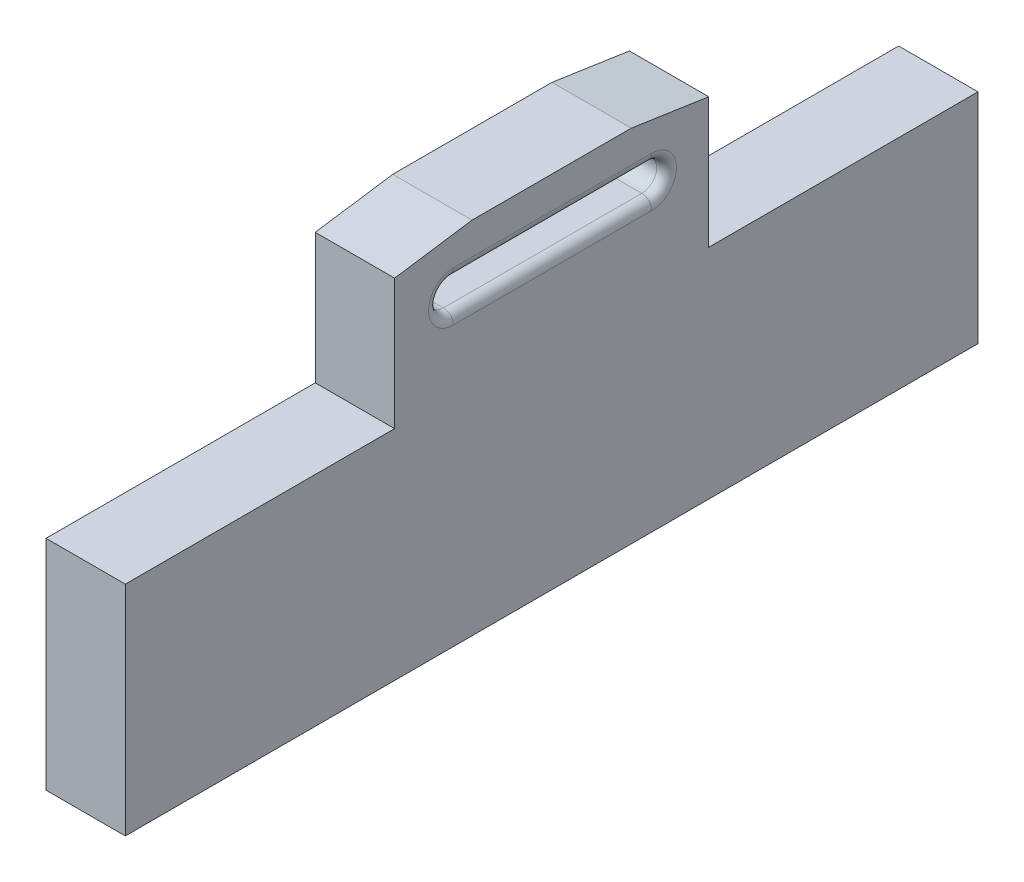
ISO-10303-21;
HEADER;
FILE_DESCRIPTION(('STEP AP214'),'2;1');
FILE_NAME('part.step','',(''),(''),'','','');
FILE_SCHEMA(('AUTOMOTIVE_DESIGN { 1 0 10303 214 1 1 1 1 }'));
ENDSEC;
DATA;
#1=APPLICATION_CONTEXT('core data for automotive mechanical design processes');
#2=APPLICATION_PROTOCOL_DEFINITION('international standard','automotive_design',2000,#1);
#3=PRODUCT_CONTEXT('',#1,'mechanical');
#4=PRODUCT('Part','Part','',(#3));
#5=PRODUCT_RELATED_PRODUCT_CATEGORY('part','',(#4));
#6=PRODUCT_DEFINITION_FORMATION('','',#4);
#7=PRODUCT_DEFINITION_CONTEXT('part definition',#1,'design');
#8=PRODUCT_DEFINITION('design','',#6,#7);
#9=PRODUCT_DEFINITION_SHAPE('','',#8);
#10=(LENGTH_UNIT() NAMED_UNIT(*) SI_UNIT(.MILLI.,.METRE.));
#11=(NAMED_UNIT(*) PLANE_ANGLE_UNIT() SI_UNIT($,.RADIAN.));
#12=(NAMED_UNIT(*) SI_UNIT($,.STERADIAN.) SOLID_ANGLE_UNIT());
#13=UNCERTAINTY_MEASURE_WITH_UNIT(LENGTH_MEASURE(1.E-05),#10,'distance_accuracy_value','');
#14=(GEOMETRIC_REPRESENTATION_CONTEXT(3) GLOBAL_UNCERTAINTY_ASSIGNED_CONTEXT((#13)) GLOBAL_UNIT_ASSIGNED_CONTEXT((#10,
#11,#12)) REPRESENTATION_CONTEXT('',''));
#15=CARTESIAN_POINT('',(0.,0.,0.));
#16=DIRECTION('',(0.,0.,1.));
#17=DIRECTION('',(1.,0.,0.));
#18=AXIS2_PLACEMENT_3D('',#15,#16,#17);
#19=CARTESIAN_POINT('',(8.,14.3083553702862,0.));
#20=DIRECTION('',(0.,0.,-1.));
#21=DIRECTION('',(0.,1.,0.));
#22=AXIS2_PLACEMENT_3D('',#19,#20,#21);
#23=PLANE('',#22);
#24=DIRECTION('',(0.,-1.,0.));
#25=VECTOR('',#24,1.);
#26=CARTESIAN_POINT('',(8.,14.3083553702862,0.));
#27=LINE('',#26,#25);
#28=CARTESIAN_POINT('',(8.,0.,-3.67644744589331E-07));
#29=VERTEX_POINT('',#28);
#30=CARTESIAN_POINT('',(8.,-21.9999843225533,-2.20076296026999E-07));
#31=VERTEX_POINT('',#30);
#32=EDGE_CURVE('E238',#29,#31,#27,.T.);
#33=ORIENTED_EDGE('',*,*,#32,.F.);
#34=DIRECTION('',(-1.,0.,0.));
#35=VECTOR('',#34,1.);
#36=CARTESIAN_POINT('',(8.,0.,-3.67644744589331E-07));
#37=LINE('',#36,#35);
#38=CARTESIAN_POINT('',(0.,0.,-3.67644744589331E-07));
#39=VERTEX_POINT('',#38);
#40=EDGE_CURVE('E217',#29,#39,#37,.T.);
#41=ORIENTED_EDGE('',*,*,#40,.T.);
#42=DIRECTION('',(0.,-1.,0.));
#43=VECTOR('',#42,1.);
#44=CARTESIAN_POINT('',(0.,14.3083553702862,0.));
#45=LINE('',#44,#43);
#46=CARTESIAN_POINT('',(0.,-21.9999843225533,0.));
#47=VERTEX_POINT('',#46);
#48=EDGE_CURVE('E235',#39,#47,#45,.T.);
#49=ORIENTED_EDGE('',*,*,#48,.T.);
#50=DIRECTION('',(-1.,0.,0.));
#51=VECTOR('',#50,1.);
#52=CARTESIAN_POINT('',(8.,-21.9999843225533,-2.20076296026999E-07));
#53=LINE('',#52,#51);
#54=EDGE_CURVE('E230',#31,#47,#53,.T.);
#55=ORIENTED_EDGE('',*,*,#54,.F.);
#56=EDGE_LOOP('',(#33,#41,#49,#55));
#57=FACE_BOUND('',#56,.T.);
#58=ADVANCED_FACE('F31',(#57),#23,.F.);
#59=CARTESIAN_POINT('',(8.,14.3083553702862,-86.0000000000091));
#60=DIRECTION('',(0.,0.,1.));
#61=DIRECTION('',(1.,0.,0.));
#62=AXIS2_PLACEMENT_3D('',#59,#60,#61);
#63=PLANE('',#62);
#64=DIRECTION('',(0.,1.,0.));
#65=VECTOR('',#64,1.);
#66=CARTESIAN_POINT('',(0.,14.3083553702862,-86.0000000000091));
#67=LINE('',#66,#65);
#68=CARTESIAN_POINT('',(0.,-21.9999843225533,-86.0000000000091));
#69=VERTEX_POINT('',#68);
#70=CARTESIAN_POINT('',(0.,0.,-85.9999996323643));
#71=VERTEX_POINT('',#70);
#72=EDGE_CURVE('E246',#69,#71,#67,.T.);
#73=ORIENTED_EDGE('',*,*,#72,.T.);
#74=DIRECTION('',(-1.,0.,0.));
#75=VECTOR('',#74,1.);
#76=CARTESIAN_POINT('',(8.,0.,-85.9999996323643));
#77=LINE('',#76,#75);
#78=CARTESIAN_POINT('',(8.,0.,-85.9999996323643));
#79=VERTEX_POINT('',#78);
#80=EDGE_CURVE('E196',#79,#71,#77,.T.);
#81=ORIENTED_EDGE('',*,*,#80,.F.);
#82=DIRECTION('',(0.,1.,0.));
#83=VECTOR('',#82,1.);
#84=CARTESIAN_POINT('',(8.,14.3083553702862,-86.0000000000091));
#85=LINE('',#84,#83);
#86=CARTESIAN_POINT('',(8.,-21.9999843225533,-86.0000000000091));
#87=VERTEX_POINT('',#86);
#88=EDGE_CURVE('E183',#87,#79,#85,.T.);
#89=ORIENTED_EDGE('',*,*,#88,.F.);
#90=DIRECTION('',(-1.,0.,0.));
#91=VECTOR('',#90,1.);
#92=CARTESIAN_POINT('',(8.,-21.9999843225533,-86.0000000000091));
#93=LINE('',#92,#91);
#94=EDGE_CURVE('E232',#87,#69,#93,.T.);
#95=ORIENTED_EDGE('',*,*,#94,.T.);
#96=EDGE_LOOP('',(#73,#81,#89,#95));
#97=FACE_BOUND('',#96,.T.);
#98=ADVANCED_FACE('F363',(#97),#63,.F.);
#99=CARTESIAN_POINT('',(8.,14.3083553702862,0.));
#100=DIRECTION('',(0.,-1.,0.));
#101=DIRECTION('',(0.,0.,-1.));
#102=AXIS2_PLACEMENT_3D('',#99,#100,#101);
#103=PLANE('',#102);
#104=DIRECTION('',(0.,0.,1.));
#105=VECTOR('',#104,1.);
#106=CARTESIAN_POINT('',(8.,14.3083553702862,0.));
#107=LINE('',#106,#105);
#108=CARTESIAN_POINT('',(8.,14.3083553702862,-51.0327021759425));
#109=VERTEX_POINT('',#108);
#110=CARTESIAN_POINT('',(8.,14.3083553702862,-34.9672978240665));
#111=VERTEX_POINT('',#110);
#112=EDGE_CURVE('E242',#109,#111,#107,.T.);
#113=ORIENTED_EDGE('',*,*,#112,.F.);
#114=DIRECTION('',(-1.,0.,0.));
#115=VECTOR('',#114,1.);
#116=CARTESIAN_POINT('',(8.,14.3083553702862,-51.0327021759425));
#117=LINE('',#116,#115);
#118=CARTESIAN_POINT('',(0.,14.3083553702862,-51.0327021759425));
#119=VERTEX_POINT('',#118);
#120=EDGE_CURVE('E198',#109,#119,#117,.T.);
#121=ORIENTED_EDGE('',*,*,#120,.T.);
#122=DIRECTION('',(0.,0.,1.));
#123=VECTOR('',#122,1.);
#124=CARTESIAN_POINT('',(0.,14.3083553702862,0.));
#125=LINE('',#124,#123);
#126=CARTESIAN_POINT('',(0.,14.3083553702862,-34.9672978240666));
#127=VERTEX_POINT('',#126);
#128=EDGE_CURVE('E240',#119,#127,#125,.T.);
#129=ORIENTED_EDGE('',*,*,#128,.T.);
#130=DIRECTION('',(1.,0.,0.));
#131=VECTOR('',#130,1.);
#132=CARTESIAN_POINT('',(8.,14.3083553702862,-34.9672978240665));
#133=LINE('',#132,#131);
#134=EDGE_CURVE('E220',#127,#111,#133,.T.);
#135=ORIENTED_EDGE('',*,*,#134,.T.);
#136=EDGE_LOOP('',(#113,#121,#129,#135));
#137=FACE_BOUND('',#136,.T.);
#138=ADVANCED_FACE('F368',(#137),#103,.F.);
#139=CARTESIAN_POINT('',(8.,-30.6125026920477,0.));
#140=DIRECTION('',(1.,0.,0.));
#141=DIRECTION('',(0.,0.,-1.));
#142=AXIS2_PLACEMENT_3D('',#139,#140,#141);
#143=PLANE('',#142);
#144=DIRECTION('',(0.,0.,1.));
#145=VECTOR('',#144,1.);
#146=CARTESIAN_POINT('',(8.,6.0850035920881,-33.0899455057634));
#147=LINE('',#146,#145);
#148=CARTESIAN_POINT('',(8.,6.08500359208809,-53.0899455057634));
#149=VERTEX_POINT('',#148);
#150=CARTESIAN_POINT('',(8.,6.0850035920881,-33.0899455057634));
#151=VERTEX_POINT('',#150);
#152=EDGE_CURVE('E256',#149,#151,#147,.T.);
#153=ORIENTED_EDGE('',*,*,#152,.T.);
#154=CARTESIAN_POINT('',(8.,8.5850035920881,-33.0899455057634));
#155=DIRECTION('',(1.,0.,0.));
#156=DIRECTION('',(0.,0.,-1.));
#157=AXIS2_PLACEMENT_3D('',#154,#155,#156);
#158=CIRCLE('',#157,2.5);
#159=CARTESIAN_POINT('',(8.,11.0850035920881,-33.0899455057634));
#160=VERTEX_POINT('',#159);
#161=EDGE_CURVE('E258',#151,#160,#158,.F.);
#162=ORIENTED_EDGE('',*,*,#161,.T.);
#163=DIRECTION('',(0.,0.,-1.));
#164=VECTOR('',#163,1.);
#165=CARTESIAN_POINT('',(8.,11.0850035920881,-53.0899455057634));
#166=LINE('',#165,#164);
#167=CARTESIAN_POINT('',(8.,11.0850035920881,-53.0899455057634));
#168=VERTEX_POINT('',#167);
#169=EDGE_CURVE('E252',#160,#168,#166,.T.);
#170=ORIENTED_EDGE('',*,*,#169,.T.);
#171=CARTESIAN_POINT('',(8.,8.5850035920881,-53.0899455057634));
#172=DIRECTION('',(1.,0.,0.));
#173=DIRECTION('',(0.,0.,-1.));
#174=AXIS2_PLACEMENT_3D('',#171,#172,#173);
#175=CIRCLE('',#174,2.5);
#176=EDGE_CURVE('E254',#168,#149,#175,.F.);
#177=ORIENTED_EDGE('',*,*,#176,.T.);
#178=EDGE_LOOP('',(#153,#162,#170,#177));
#179=FACE_BOUND('',#178,.T.);
#180=DIRECTION('',(0.,0.,1.));
#181=VECTOR('',#180,1.);
#182=CARTESIAN_POINT('',(8.,0.,-85.9999996323643));
#183=LINE('',#182,#181);
#184=CARTESIAN_POINT('',(8.,0.,-58.8427380262315));
#185=VERTEX_POINT('',#184);
#186=EDGE_CURVE('E162',#79,#185,#183,.T.);
#187=ORIENTED_EDGE('',*,*,#186,.T.);
#188=DIRECTION('',(0.,1.,0.));
#189=VECTOR('',#188,1.);
#190=CARTESIAN_POINT('',(8.,0.,-58.8427380262315));
#191=LINE('',#190,#189);
#192=CARTESIAN_POINT('',(8.,13.1480421627315,-58.8427380262315));
#193=VERTEX_POINT('',#192);
#194=EDGE_CURVE('E173',#185,#193,#191,.T.);
#195=ORIENTED_EDGE('',*,*,#194,.T.);
#196=DIRECTION('',(0.,0.146954007322754,0.989143326182705));
#197=VECTOR('',#196,1.);
#198=CARTESIAN_POINT('',(8.,13.1480421627315,-58.8427380262315));
#199=LINE('',#198,#197);
#200=EDGE_CURVE('E170',#193,#109,#199,.T.);
#201=ORIENTED_EDGE('',*,*,#200,.T.);
#202=ORIENTED_EDGE('',*,*,#112,.T.);
#203=DIRECTION('',(0.,-0.146954007322754,0.989143326182705));
#204=VECTOR('',#203,1.);
#205=CARTESIAN_POINT('',(8.,13.1480421627315,-27.1572619737776));
#206=LINE('',#205,#204);
#207=CARTESIAN_POINT('',(8.,13.1480421627315,-27.1572619737776));
#208=VERTEX_POINT('',#207);
#209=EDGE_CURVE('E203',#111,#208,#206,.T.);
#210=ORIENTED_EDGE('',*,*,#209,.T.);
#211=DIRECTION('',(0.,-1.,0.));
#212=VECTOR('',#211,1.);
#213=CARTESIAN_POINT('',(8.,0.,-27.1572619737776));
#214=LINE('',#213,#212);
#215=CARTESIAN_POINT('',(8.,0.,-27.1572619737776));
#216=VERTEX_POINT('',#215);
#217=EDGE_CURVE('E206',#208,#216,#214,.T.);
#218=ORIENTED_EDGE('',*,*,#217,.T.);
#219=DIRECTION('',(0.,0.,1.));
#220=VECTOR('',#219,1.);
#221=CARTESIAN_POINT('',(8.,0.,-3.67644744589331E-07));
#222=LINE('',#221,#220);
#223=EDGE_CURVE('E210',#216,#29,#222,.T.);
#224=ORIENTED_EDGE('',*,*,#223,.T.);
#225=ORIENTED_EDGE('',*,*,#32,.T.);
#226=DIRECTION('',(0.,0.,-1.));
#227=VECTOR('',#226,1.);
#228=CARTESIAN_POINT('',(8.,-21.9999843225533,-2.20076296026999E-07));
#229=LINE('',#228,#227);
#230=EDGE_CURVE('E228',#31,#87,#229,.T.);
#231=ORIENTED_EDGE('',*,*,#230,.T.);
#232=ORIENTED_EDGE('',*,*,#88,.T.);
#233=EDGE_LOOP('',(#187,#195,#201,#202,#210,#218,#224,#225,#231,#232));
#234=FACE_BOUND('',#233,.T.);
#235=ADVANCED_FACE('F180',(#179,#234),#143,.T.);
#236=CARTESIAN_POINT('',(0.,-30.6125026920477,0.));
#237=DIRECTION('',(1.,0.,0.));
#238=DIRECTION('',(0.,0.,-1.));
#239=AXIS2_PLACEMENT_3D('',#236,#237,#238);
#240=PLANE('',#239);
#241=DIRECTION('',(0.,0.,-1.));
#242=VECTOR('',#241,1.);
#243=CARTESIAN_POINT('',(0.,11.0850035920881,0.));
#244=LINE('',#243,#242);
#245=CARTESIAN_POINT('',(0.,11.0850035920881,-53.0899455057634));
#246=VERTEX_POINT('',#245);
#247=CARTESIAN_POINT('',(0.,11.0850035920881,-33.0899455057634));
#248=VERTEX_POINT('',#247);
#249=EDGE_CURVE('E275',#246,#248,#244,.F.);
#250=ORIENTED_EDGE('',*,*,#249,.T.);
#251=CARTESIAN_POINT('',(0.,8.5850035920881,-33.0899455057634));
#252=DIRECTION('',(1.,0.,0.));
#253=DIRECTION('',(0.,0.,-1.));
#254=AXIS2_PLACEMENT_3D('',#251,#252,#253);
#255=CIRCLE('',#254,2.5);
#256=CARTESIAN_POINT('',(0.,6.08500359208809,-33.0899455057634));
#257=VERTEX_POINT('',#256);
#258=EDGE_CURVE('E280',#248,#257,#255,.T.);
#259=ORIENTED_EDGE('',*,*,#258,.T.);
#260=DIRECTION('',(0.,0.,1.));
#261=VECTOR('',#260,1.);
#262=CARTESIAN_POINT('',(0.,6.0850035920881,0.));
#263=LINE('',#262,#261);
#264=CARTESIAN_POINT('',(0.,6.08500359208809,-53.0899455057634));
#265=VERTEX_POINT('',#264);
#266=EDGE_CURVE('E55',#257,#265,#263,.F.);
#267=ORIENTED_EDGE('',*,*,#266,.T.);
#268=CARTESIAN_POINT('',(0.,8.5850035920881,-53.0899455057634));
#269=DIRECTION('',(1.,0.,0.));
#270=DIRECTION('',(0.,0.,-1.));
#271=AXIS2_PLACEMENT_3D('',#268,#269,#270);
#272=CIRCLE('',#271,2.5);
#273=EDGE_CURVE('E277',#265,#246,#272,.T.);
#274=ORIENTED_EDGE('',*,*,#273,.T.);
#275=EDGE_LOOP('',(#250,#259,#267,#274));
#276=FACE_BOUND('',#275,.T.);
#277=DIRECTION('',(0.,1.,0.));
#278=VECTOR('',#277,1.);
#279=CARTESIAN_POINT('',(0.,0.,-58.8427380262315));
#280=LINE('',#279,#278);
#281=CARTESIAN_POINT('',(0.,0.,-58.8427380262315));
#282=VERTEX_POINT('',#281);
#283=CARTESIAN_POINT('',(0.,13.1480421627315,-58.8427380262315));
#284=VERTEX_POINT('',#283);
#285=EDGE_CURVE('E186',#282,#284,#280,.T.);
#286=ORIENTED_EDGE('',*,*,#285,.F.);
#287=DIRECTION('',(0.,0.,1.));
#288=VECTOR('',#287,1.);
#289=CARTESIAN_POINT('',(0.,0.,-85.9999996323643));
#290=LINE('',#289,#288);
#291=EDGE_CURVE('E165',#71,#282,#290,.T.);
#292=ORIENTED_EDGE('',*,*,#291,.F.);
#293=ORIENTED_EDGE('',*,*,#72,.F.);
#294=DIRECTION('',(0.,0.,-1.));
#295=VECTOR('',#294,1.);
#296=CARTESIAN_POINT('',(0.,-21.9999843225533,-2.20076296026999E-07));
#297=LINE('',#296,#295);
#298=EDGE_CURVE('E227',#47,#69,#297,.T.);
#299=ORIENTED_EDGE('',*,*,#298,.F.);
#300=ORIENTED_EDGE('',*,*,#48,.F.);
#301=DIRECTION('',(0.,0.,1.));
#302=VECTOR('',#301,1.);
#303=CARTESIAN_POINT('',(0.,0.,-3.67644744589331E-07));
#304=LINE('',#303,#302);
#305=CARTESIAN_POINT('',(0.,0.,-27.1572619737776));
#306=VERTEX_POINT('',#305);
#307=EDGE_CURVE('E207',#306,#39,#304,.T.);
#308=ORIENTED_EDGE('',*,*,#307,.F.);
#309=DIRECTION('',(0.,-1.,0.));
#310=VECTOR('',#309,1.);
#311=CARTESIAN_POINT('',(0.,0.,-27.1572619737776));
#312=LINE('',#311,#310);
#313=CARTESIAN_POINT('',(0.,13.1480421627315,-27.1572619737776));
#314=VERTEX_POINT('',#313);
#315=EDGE_CURVE('E202',#314,#306,#312,.T.);
#316=ORIENTED_EDGE('',*,*,#315,.F.);
#317=DIRECTION('',(0.,0.146954007322754,-0.989143326182705));
#318=VECTOR('',#317,1.);
#319=CARTESIAN_POINT('',(0.,8.25547126211367,5.774496352438));
#320=LINE('',#319,#318);
#321=EDGE_CURVE('E244',#314,#127,#320,.T.);
#322=ORIENTED_EDGE('',*,*,#321,.T.);
#323=ORIENTED_EDGE('',*,*,#128,.F.);
#324=DIRECTION('',(0.,0.146954007322754,0.989143326182705));
#325=VECTOR('',#324,1.);
#326=CARTESIAN_POINT('',(0.,13.1480421627315,-58.8427380262315));
#327=LINE('',#326,#325);
#328=EDGE_CURVE('E184',#284,#119,#327,.T.);
#329=ORIENTED_EDGE('',*,*,#328,.F.);
#330=EDGE_LOOP('',(#286,#292,#293,#299,#300,#308,#316,#322,#323,#329));
#331=FACE_BOUND('',#330,.T.);
#332=ADVANCED_FACE('F308',(#276,#331),#240,.F.);
#333=CARTESIAN_POINT('',(8.,-21.9999843225533,-2.20076296026999E-07));
#334=DIRECTION('',(0.,1.,0.));
#335=DIRECTION('',(0.,0.,1.));
#336=AXIS2_PLACEMENT_3D('',#333,#334,#335);
#337=PLANE('',#336);
#338=ORIENTED_EDGE('',*,*,#298,.T.);
#339=ORIENTED_EDGE('',*,*,#94,.F.);
#340=ORIENTED_EDGE('',*,*,#230,.F.);
#341=ORIENTED_EDGE('',*,*,#54,.T.);
#342=EDGE_LOOP('',(#338,#339,#340,#341));
#343=FACE_BOUND('',#342,.T.);
#344=ADVANCED_FACE('F378',(#343),#337,.F.);
#345=CARTESIAN_POINT('',(8.,13.1480421627315,-27.1572619737776));
#346=DIRECTION('',(0.,-0.989143326182704,-0.146954007322754));
#347=DIRECTION('',(0.,0.146954007322754,-0.989143326182705));
#348=AXIS2_PLACEMENT_3D('',#345,#346,#347);
#349=PLANE('',#348);
#350=ORIENTED_EDGE('',*,*,#321,.F.);
#351=DIRECTION('',(-1.,0.,0.));
#352=VECTOR('',#351,1.);
#353=CARTESIAN_POINT('',(8.,13.1480421627315,-27.1572619737776));
#354=LINE('',#353,#352);
#355=EDGE_CURVE('E213',#208,#314,#354,.T.);
#356=ORIENTED_EDGE('',*,*,#355,.F.);
#357=ORIENTED_EDGE('',*,*,#209,.F.);
#358=ORIENTED_EDGE('',*,*,#134,.F.);
#359=EDGE_LOOP('',(#350,#356,#357,#358));
#360=FACE_BOUND('',#359,.T.);
#361=ADVANCED_FACE('F383',(#360),#349,.F.);
#362=CARTESIAN_POINT('',(8.,0.,-3.67644744589331E-07));
#363=DIRECTION('',(0.,-1.,0.));
#364=DIRECTION('',(0.,0.,-1.));
#365=AXIS2_PLACEMENT_3D('',#362,#363,#364);
#366=PLANE('',#365);
#367=ORIENTED_EDGE('',*,*,#307,.T.);
#368=ORIENTED_EDGE('',*,*,#40,.F.);
#369=ORIENTED_EDGE('',*,*,#223,.F.);
#370=DIRECTION('',(-1.,0.,0.));
#371=VECTOR('',#370,1.);
#372=CARTESIAN_POINT('',(8.,0.,-27.1572619737776));
#373=LINE('',#372,#371);
#374=EDGE_CURVE('E221',#216,#306,#373,.T.);
#375=ORIENTED_EDGE('',*,*,#374,.T.);
#376=EDGE_LOOP('',(#367,#368,#369,#375));
#377=FACE_BOUND('',#376,.T.);
#378=ADVANCED_FACE('F387',(#377),#366,.F.);
#379=CARTESIAN_POINT('',(8.,0.,-27.1572619737776));
#380=DIRECTION('',(0.,0.,-1.));
#381=DIRECTION('',(0.,1.,0.));
#382=AXIS2_PLACEMENT_3D('',#379,#380,#381);
#383=PLANE('',#382);
#384=ORIENTED_EDGE('',*,*,#315,.T.);
#385=ORIENTED_EDGE('',*,*,#374,.F.);
#386=ORIENTED_EDGE('',*,*,#217,.F.);
#387=ORIENTED_EDGE('',*,*,#355,.T.);
#388=EDGE_LOOP('',(#384,#385,#386,#387));
#389=FACE_BOUND('',#388,.T.);
#390=ADVANCED_FACE('F389',(#389),#383,.F.);
#391=CARTESIAN_POINT('',(8.,13.1480421627315,-58.8427380262315));
#392=DIRECTION('',(0.,-0.989143326182704,0.146954007322754));
#393=DIRECTION('',(0.,-0.146954007322754,-0.989143326182705));
#394=AXIS2_PLACEMENT_3D('',#391,#392,#393);
#395=PLANE('',#394);
#396=ORIENTED_EDGE('',*,*,#200,.F.);
#397=DIRECTION('',(-1.,0.,0.));
#398=VECTOR('',#397,1.);
#399=CARTESIAN_POINT('',(8.,13.1480421627315,-58.8427380262315));
#400=LINE('',#399,#398);
#401=EDGE_CURVE('E169',#193,#284,#400,.T.);
#402=ORIENTED_EDGE('',*,*,#401,.T.);
#403=ORIENTED_EDGE('',*,*,#328,.T.);
#404=ORIENTED_EDGE('',*,*,#120,.F.);
#405=EDGE_LOOP('',(#396,#402,#403,#404));
#406=FACE_BOUND('',#405,.T.);
#407=ADVANCED_FACE('F392',(#406),#395,.F.);
#408=CARTESIAN_POINT('',(8.,0.,-85.9999996323643));
#409=DIRECTION('',(0.,-1.,0.));
#410=DIRECTION('',(0.,0.,-1.));
#411=AXIS2_PLACEMENT_3D('',#408,#409,#410);
#412=PLANE('',#411);
#413=ORIENTED_EDGE('',*,*,#291,.T.);
#414=DIRECTION('',(-1.,0.,0.));
#415=VECTOR('',#414,1.);
#416=CARTESIAN_POINT('',(8.,0.,-58.8427380262315));
#417=LINE('',#416,#415);
#418=EDGE_CURVE('E158',#185,#282,#417,.T.);
#419=ORIENTED_EDGE('',*,*,#418,.F.);
#420=ORIENTED_EDGE('',*,*,#186,.F.);
#421=ORIENTED_EDGE('',*,*,#80,.T.);
#422=EDGE_LOOP('',(#413,#419,#420,#421));
#423=FACE_BOUND('',#422,.T.);
#424=ADVANCED_FACE('F160',(#423),#412,.F.);
#425=CARTESIAN_POINT('',(8.,0.,-58.8427380262315));
#426=DIRECTION('',(0.,0.,1.));
#427=DIRECTION('',(1.,0.,0.));
#428=AXIS2_PLACEMENT_3D('',#425,#426,#427);
#429=PLANE('',#428);
#430=ORIENTED_EDGE('',*,*,#285,.T.);
#431=ORIENTED_EDGE('',*,*,#401,.F.);
#432=ORIENTED_EDGE('',*,*,#194,.F.);
#433=ORIENTED_EDGE('',*,*,#418,.T.);
#434=EDGE_LOOP('',(#430,#431,#432,#433));
#435=FACE_BOUND('',#434,.T.);
#436=ADVANCED_FACE('F174',(#435),#429,.F.);
#437=CARTESIAN_POINT('',(8.,8.5850035920881,-53.0899455057634));
#438=DIRECTION('',(-1.,0.,0.));
#439=DIRECTION('',(0.,0.,1.));
#440=AXIS2_PLACEMENT_3D('',#437,#438,#439);
#441=CYLINDRICAL_SURFACE('',#440,1.5);
#442=DIRECTION('',(-1.,0.,0.));
#443=VECTOR('',#442,1.);
#444=CARTESIAN_POINT('',(8.,7.08500359208809,-53.0899455057634));
#445=LINE('',#444,#443);
#446=CARTESIAN_POINT('',(7.,7.08500359208809,-53.0899455057634));
#447=VERTEX_POINT('',#446);
#448=CARTESIAN_POINT('',(1.,7.08500359208809,-53.0899455057634));
#449=VERTEX_POINT('',#448);
#450=EDGE_CURVE('E189',#447,#449,#445,.T.);
#451=ORIENTED_EDGE('',*,*,#450,.F.);
#452=CARTESIAN_POINT('',(7.,8.5850035920881,-53.0899455057634));
#453=DIRECTION('',(1.,0.,0.));
#454=DIRECTION('',(0.,0.,-1.));
#455=AXIS2_PLACEMENT_3D('',#452,#453,#454);
#456=CIRCLE('',#455,1.5);
#457=CARTESIAN_POINT('',(7.,10.0850035920881,-53.0899455057634));
#458=VERTEX_POINT('',#457);
#459=EDGE_CURVE('E273',#447,#458,#456,.T.);
#460=ORIENTED_EDGE('',*,*,#459,.T.);
#461=DIRECTION('',(-1.,0.,0.));
#462=VECTOR('',#461,1.);
#463=CARTESIAN_POINT('',(8.,10.0850035920881,-53.0899455057634));
#464=LINE('',#463,#462);
#465=CARTESIAN_POINT('',(1.,10.0850035920881,-53.0899455057634));
#466=VERTEX_POINT('',#465);
#467=EDGE_CURVE('E194',#458,#466,#464,.T.);
#468=ORIENTED_EDGE('',*,*,#467,.T.);
#469=CARTESIAN_POINT('',(1.,8.5850035920881,-53.0899455057634));
#470=DIRECTION('',(1.,0.,0.));
#471=DIRECTION('',(0.,0.,-1.));
#472=AXIS2_PLACEMENT_3D('',#469,#470,#471);
#473=CIRCLE('',#472,1.5);
#474=EDGE_CURVE('E271',#466,#449,#473,.F.);
#475=ORIENTED_EDGE('',*,*,#474,.T.);
#476=EDGE_LOOP('',(#451,#460,#468,#475));
#477=FACE_BOUND('',#476,.T.);
#478=ADVANCED_FACE('F336',(#477),#441,.F.);
#479=CARTESIAN_POINT('',(8.,10.0850035920881,-53.0899455057634));
#480=DIRECTION('',(0.,1.,0.));
#481=DIRECTION('',(0.,0.,1.));
#482=AXIS2_PLACEMENT_3D('',#479,#480,#481);
#483=PLANE('',#482);
#484=ORIENTED_EDGE('',*,*,#467,.F.);
#485=DIRECTION('',(0.,0.,-1.));
#486=VECTOR('',#485,1.);
#487=CARTESIAN_POINT('',(7.,10.0850035920881,-33.0899455057634));
#488=LINE('',#487,#486);
#489=CARTESIAN_POINT('',(7.,10.0850035920881,-33.0899455057634));
#490=VERTEX_POINT('',#489);
#491=EDGE_CURVE('E11',#458,#490,#488,.F.);
#492=ORIENTED_EDGE('',*,*,#491,.T.);
#493=DIRECTION('',(-1.,0.,0.));
#494=VECTOR('',#493,1.);
#495=CARTESIAN_POINT('',(8.,10.0850035920881,-33.0899455057634));
#496=LINE('',#495,#494);
#497=CARTESIAN_POINT('',(1.,10.0850035920881,-33.0899455057634));
#498=VERTEX_POINT('',#497);
#499=EDGE_CURVE('E321',#490,#498,#496,.T.);
#500=ORIENTED_EDGE('',*,*,#499,.T.);
#501=DIRECTION('',(0.,0.,-1.));
#502=VECTOR('',#501,1.);
#503=CARTESIAN_POINT('',(1.,10.0850035920881,-53.0899455057634));
#504=LINE('',#503,#502);
#505=EDGE_CURVE('E40',#498,#466,#504,.T.);
#506=ORIENTED_EDGE('',*,*,#505,.T.);
#507=EDGE_LOOP('',(#484,#492,#500,#506));
#508=FACE_BOUND('',#507,.T.);
#509=ADVANCED_FACE('F325',(#508),#483,.F.);
#510=CARTESIAN_POINT('',(8.,8.5850035920881,-33.0899455057634));
#511=DIRECTION('',(-1.,0.,0.));
#512=DIRECTION('',(0.,0.,1.));
#513=AXIS2_PLACEMENT_3D('',#510,#511,#512);
#514=CYLINDRICAL_SURFACE('',#513,1.5);
#515=ORIENTED_EDGE('',*,*,#499,.F.);
#516=CARTESIAN_POINT('',(7.,8.5850035920881,-33.0899455057634));
#517=DIRECTION('',(1.,0.,0.));
#518=DIRECTION('',(0.,0.,-1.));
#519=AXIS2_PLACEMENT_3D('',#516,#517,#518);
#520=CIRCLE('',#519,1.5);
#521=CARTESIAN_POINT('',(7.,7.08500359208809,-33.0899455057634));
#522=VERTEX_POINT('',#521);
#523=EDGE_CURVE('E264',#490,#522,#520,.T.);
#524=ORIENTED_EDGE('',*,*,#523,.T.);
#525=DIRECTION('',(-1.,0.,0.));
#526=VECTOR('',#525,1.);
#527=CARTESIAN_POINT('',(8.,7.08500359208809,-33.0899455057634));
#528=LINE('',#527,#526);
#529=CARTESIAN_POINT('',(1.,7.08500359208809,-33.0899455057634));
#530=VERTEX_POINT('',#529);
#531=EDGE_CURVE('E324',#522,#530,#528,.T.);
#532=ORIENTED_EDGE('',*,*,#531,.T.);
#533=CARTESIAN_POINT('',(1.,8.5850035920881,-33.0899455057634));
#534=DIRECTION('',(1.,0.,0.));
#535=DIRECTION('',(0.,0.,-1.));
#536=AXIS2_PLACEMENT_3D('',#533,#534,#535);
#537=CIRCLE('',#536,1.5);
#538=EDGE_CURVE('E261',#530,#498,#537,.F.);
#539=ORIENTED_EDGE('',*,*,#538,.T.);
#540=EDGE_LOOP('',(#515,#524,#532,#539));
#541=FACE_BOUND('',#540,.T.);
#542=ADVANCED_FACE('F320',(#541),#514,.F.);
#543=CARTESIAN_POINT('',(8.,7.08500359208809,-53.0899455057634));
#544=DIRECTION('',(0.,-1.,0.));
#545=DIRECTION('',(0.,0.,-1.));
#546=AXIS2_PLACEMENT_3D('',#543,#544,#545);
#547=PLANE('',#546);
#548=ORIENTED_EDGE('',*,*,#531,.F.);
#549=DIRECTION('',(0.,0.,1.));
#550=VECTOR('',#549,1.);
#551=CARTESIAN_POINT('',(7.,7.08500359208809,-53.0899455057634));
#552=LINE('',#551,#550);
#553=EDGE_CURVE('E269',#522,#447,#552,.F.);
#554=ORIENTED_EDGE('',*,*,#553,.T.);
#555=ORIENTED_EDGE('',*,*,#450,.T.);
#556=DIRECTION('',(0.,0.,1.));
#557=VECTOR('',#556,1.);
#558=CARTESIAN_POINT('',(1.,7.08500359208809,-53.0899455057634));
#559=LINE('',#558,#557);
#560=EDGE_CURVE('E267',#449,#530,#559,.T.);
#561=ORIENTED_EDGE('',*,*,#560,.T.);
#562=EDGE_LOOP('',(#548,#554,#555,#561));
#563=FACE_BOUND('',#562,.T.);
#564=ADVANCED_FACE('F332',(#563),#547,.F.);
#565=CARTESIAN_POINT('',(7.,8.5850035920881,-53.0899455057634));
#566=DIRECTION('',(1.,0.,0.));
#567=DIRECTION('',(0.,0.,-1.));
#568=AXIS2_PLACEMENT_3D('',#565,#566,#567);
#569=TOROIDAL_SURFACE('',#568,2.5,1.);
#570=CARTESIAN_POINT('',(7.,11.0850035920881,-53.0899455057634));
#571=DIRECTION('',(0.,0.,1.));
#572=DIRECTION('',(1.,0.,0.));
#573=AXIS2_PLACEMENT_3D('',#570,#571,#572);
#574=CIRCLE('',#573,1.);
#575=EDGE_CURVE('E287',#458,#168,#574,.T.);
#576=ORIENTED_EDGE('',*,*,#575,.F.);
#577=ORIENTED_EDGE('',*,*,#459,.F.);
#578=CARTESIAN_POINT('',(7.,6.08500359208809,-53.0899455057634));
#579=DIRECTION('',(0.,0.,1.));
#580=DIRECTION('',(1.,0.,0.));
#581=AXIS2_PLACEMENT_3D('',#578,#579,#580);
#582=CIRCLE('',#581,1.);
#583=EDGE_CURVE('E290',#149,#447,#582,.T.);
#584=ORIENTED_EDGE('',*,*,#583,.F.);
#585=ORIENTED_EDGE('',*,*,#176,.F.);
#586=EDGE_LOOP('',(#576,#577,#584,#585));
#587=FACE_BOUND('',#586,.T.);
#588=ADVANCED_FACE('F340',(#587),#569,.T.);
#589=CARTESIAN_POINT('',(7.,6.0850035920881,0.));
#590=DIRECTION('',(0.,0.,-1.));
#591=DIRECTION('',(-1.,0.,0.));
#592=AXIS2_PLACEMENT_3D('',#589,#590,#591);
#593=CYLINDRICAL_SURFACE('',#592,1.);
#594=ORIENTED_EDGE('',*,*,#583,.T.);
#595=ORIENTED_EDGE('',*,*,#553,.F.);
#596=CARTESIAN_POINT('',(7.,6.0850035920881,-33.0899455057634));
#597=DIRECTION('',(0.,0.,1.));
#598=DIRECTION('',(1.,0.,0.));
#599=AXIS2_PLACEMENT_3D('',#596,#597,#598);
#600=CIRCLE('',#599,1.);
#601=EDGE_CURVE('E285',#151,#522,#600,.T.);
#602=ORIENTED_EDGE('',*,*,#601,.F.);
#603=ORIENTED_EDGE('',*,*,#152,.F.);
#604=EDGE_LOOP('',(#594,#595,#602,#603));
#605=FACE_BOUND('',#604,.T.);
#606=ADVANCED_FACE('F344',(#605),#593,.T.);
#607=CARTESIAN_POINT('',(7.,11.0850035920881,0.));
#608=DIRECTION('',(0.,0.,1.));
#609=DIRECTION('',(1.,0.,0.));
#610=AXIS2_PLACEMENT_3D('',#607,#608,#609);
#611=CYLINDRICAL_SURFACE('',#610,1.);
#612=ORIENTED_EDGE('',*,*,#575,.T.);
#613=ORIENTED_EDGE('',*,*,#169,.F.);
#614=CARTESIAN_POINT('',(7.,11.0850035920881,-33.0899455057634));
#615=DIRECTION('',(0.,0.,1.));
#616=DIRECTION('',(1.,0.,0.));
#617=AXIS2_PLACEMENT_3D('',#614,#615,#616);
#618=CIRCLE('',#617,1.);
#619=EDGE_CURVE('E283',#490,#160,#618,.T.);
#620=ORIENTED_EDGE('',*,*,#619,.F.);
#621=ORIENTED_EDGE('',*,*,#491,.F.);
#622=EDGE_LOOP('',(#612,#613,#620,#621));
#623=FACE_BOUND('',#622,.T.);
#624=ADVANCED_FACE('F350',(#623),#611,.T.);
#625=CARTESIAN_POINT('',(7.,8.5850035920881,-33.0899455057634));
#626=DIRECTION('',(1.,0.,0.));
#627=DIRECTION('',(0.,0.,-1.));
#628=AXIS2_PLACEMENT_3D('',#625,#626,#627);
#629=TOROIDAL_SURFACE('',#628,2.5,1.);
#630=ORIENTED_EDGE('',*,*,#601,.T.);
#631=ORIENTED_EDGE('',*,*,#523,.F.);
#632=ORIENTED_EDGE('',*,*,#619,.T.);
#633=ORIENTED_EDGE('',*,*,#161,.F.);
#634=EDGE_LOOP('',(#630,#631,#632,#633));
#635=FACE_BOUND('',#634,.T.);
#636=ADVANCED_FACE('F353',(#635),#629,.T.);
#637=CARTESIAN_POINT('',(1.,8.5850035920881,-53.0899455057634));
#638=DIRECTION('',(1.,0.,0.));
#639=DIRECTION('',(0.,0.,-1.));
#640=AXIS2_PLACEMENT_3D('',#637,#638,#639);
#641=TOROIDAL_SURFACE('',#640,2.5,1.);
#642=CARTESIAN_POINT('',(1.,11.0850035920881,-53.0899455057634));
#643=DIRECTION('',(0.,0.,1.));
#644=DIRECTION('',(1.,0.,0.));
#645=AXIS2_PLACEMENT_3D('',#642,#643,#644);
#646=CIRCLE('',#645,1.);
#647=EDGE_CURVE('E295',#246,#466,#646,.T.);
#648=ORIENTED_EDGE('',*,*,#647,.F.);
#649=ORIENTED_EDGE('',*,*,#273,.F.);
#650=CARTESIAN_POINT('',(1.,6.08500359208809,-53.0899455057634));
#651=DIRECTION('',(0.,0.,1.));
#652=DIRECTION('',(1.,0.,0.));
#653=AXIS2_PLACEMENT_3D('',#650,#651,#652);
#654=CIRCLE('',#653,1.);
#655=EDGE_CURVE('E35',#449,#265,#654,.T.);
#656=ORIENTED_EDGE('',*,*,#655,.F.);
#657=ORIENTED_EDGE('',*,*,#474,.F.);
#658=EDGE_LOOP('',(#648,#649,#656,#657));
#659=FACE_BOUND('',#658,.T.);
#660=ADVANCED_FACE('F33',(#659),#641,.T.);
#661=CARTESIAN_POINT('',(1.,6.08500359208809,-53.0899455057634));
#662=DIRECTION('',(0.,0.,1.));
#663=DIRECTION('',(1.,0.,0.));
#664=AXIS2_PLACEMENT_3D('',#661,#662,#663);
#665=CYLINDRICAL_SURFACE('',#664,1.);
#666=ORIENTED_EDGE('',*,*,#655,.T.);
#667=ORIENTED_EDGE('',*,*,#266,.F.);
#668=CARTESIAN_POINT('',(1.,6.08500359208809,-33.0899455057634));
#669=DIRECTION('',(0.,0.,1.));
#670=DIRECTION('',(1.,0.,0.));
#671=AXIS2_PLACEMENT_3D('',#668,#669,#670);
#672=CIRCLE('',#671,1.);
#673=EDGE_CURVE('E48',#530,#257,#672,.T.);
#674=ORIENTED_EDGE('',*,*,#673,.F.);
#675=ORIENTED_EDGE('',*,*,#560,.F.);
#676=EDGE_LOOP('',(#666,#667,#674,#675));
#677=FACE_BOUND('',#676,.T.);
#678=ADVANCED_FACE('F305',(#677),#665,.T.);
#679=CARTESIAN_POINT('',(1.,11.0850035920881,-53.0899455057634));
#680=DIRECTION('',(0.,0.,-1.));
#681=DIRECTION('',(-1.,0.,0.));
#682=AXIS2_PLACEMENT_3D('',#679,#680,#681);
#683=CYLINDRICAL_SURFACE('',#682,1.);
#684=ORIENTED_EDGE('',*,*,#647,.T.);
#685=ORIENTED_EDGE('',*,*,#505,.F.);
#686=CARTESIAN_POINT('',(1.,11.0850035920881,-33.0899455057634));
#687=DIRECTION('',(0.,0.,1.));
#688=DIRECTION('',(1.,0.,0.));
#689=AXIS2_PLACEMENT_3D('',#686,#687,#688);
#690=CIRCLE('',#689,1.);
#691=EDGE_CURVE('E293',#248,#498,#690,.T.);
#692=ORIENTED_EDGE('',*,*,#691,.F.);
#693=ORIENTED_EDGE('',*,*,#249,.F.);
#694=EDGE_LOOP('',(#684,#685,#692,#693));
#695=FACE_BOUND('',#694,.T.);
#696=ADVANCED_FACE('F312',(#695),#683,.T.);
#697=CARTESIAN_POINT('',(1.,8.5850035920881,-33.0899455057634));
#698=DIRECTION('',(1.,0.,0.));
#699=DIRECTION('',(0.,0.,-1.));
#700=AXIS2_PLACEMENT_3D('',#697,#698,#699);
#701=TOROIDAL_SURFACE('',#700,2.5,1.);
#702=ORIENTED_EDGE('',*,*,#673,.T.);
#703=ORIENTED_EDGE('',*,*,#258,.F.);
#704=ORIENTED_EDGE('',*,*,#691,.T.);
#705=ORIENTED_EDGE('',*,*,#538,.F.);
#706=EDGE_LOOP('',(#702,#703,#704,#705));
#707=FACE_BOUND('',#706,.T.);
#708=ADVANCED_FACE('F311',(#707),#701,.T.);
#709=CLOSED_SHELL('',(#58,#98,#138,#235,#332,#344,#361,#378,#390,#407,#424,#436,#478,#509,#542,
#564,#588,#606,#624,#636,#660,#678,#696,#708));
#710=MANIFOLD_SOLID_BREP('B2',#709);
#711=ADVANCED_BREP_SHAPE_REPRESENTATION('',(#18,#710),#14);
#712=SHAPE_DEFINITION_REPRESENTATION(#9,#711);
ENDSEC;
END-ISO-10303-21;
